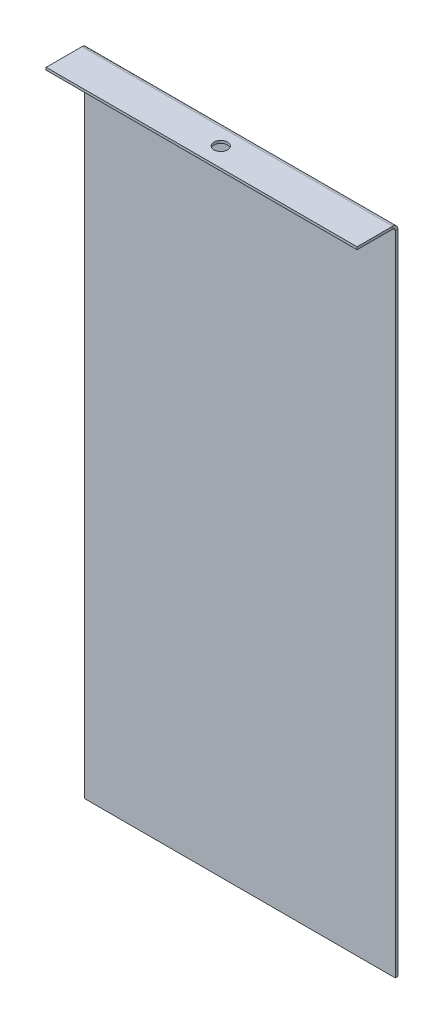
ISO-10303-21;
HEADER;
FILE_DESCRIPTION(('STEP AP214'),'2;1');
FILE_NAME('part.step','',(''),(''),'','','');
FILE_SCHEMA(('AUTOMOTIVE_DESIGN { 1 0 10303 214 1 1 1 1 }'));
ENDSEC;
DATA;
#1=APPLICATION_CONTEXT('core data for automotive mechanical design processes');
#2=APPLICATION_PROTOCOL_DEFINITION('international standard','automotive_design',2000,#1);
#3=PRODUCT_CONTEXT('',#1,'mechanical');
#4=PRODUCT('Part','Part','',(#3));
#5=PRODUCT_RELATED_PRODUCT_CATEGORY('part','',(#4));
#6=PRODUCT_DEFINITION_FORMATION('','',#4);
#7=PRODUCT_DEFINITION_CONTEXT('part definition',#1,'design');
#8=PRODUCT_DEFINITION('design','',#6,#7);
#9=PRODUCT_DEFINITION_SHAPE('','',#8);
#10=(LENGTH_UNIT() NAMED_UNIT(*) SI_UNIT(.MILLI.,.METRE.));
#11=(NAMED_UNIT(*) PLANE_ANGLE_UNIT() SI_UNIT($,.RADIAN.));
#12=(NAMED_UNIT(*) SI_UNIT($,.STERADIAN.) SOLID_ANGLE_UNIT());
#13=UNCERTAINTY_MEASURE_WITH_UNIT(LENGTH_MEASURE(1.E-05),#10,'distance_accuracy_value','');
#14=(GEOMETRIC_REPRESENTATION_CONTEXT(3) GLOBAL_UNCERTAINTY_ASSIGNED_CONTEXT((#13)) GLOBAL_UNIT_ASSIGNED_CONTEXT((#10,
#11,#12)) REPRESENTATION_CONTEXT('',''));
#15=CARTESIAN_POINT('',(0.,0.,0.));
#16=DIRECTION('',(0.,0.,1.));
#17=DIRECTION('',(1.,0.,0.));
#18=AXIS2_PLACEMENT_3D('',#15,#16,#17);
#19=CARTESIAN_POINT('',(0.,0.,1.5875));
#20=DIRECTION('',(1.,0.,0.));
#21=DIRECTION('',(0.,-1.,0.));
#22=AXIS2_PLACEMENT_3D('',#19,#20,#21);
#23=PLANE('',#22);
#24=DIRECTION('',(0.,-1.,0.));
#25=VECTOR('',#24,1.);
#26=CARTESIAN_POINT('',(0.,0.,1.5875));
#27=LINE('',#26,#25);
#28=CARTESIAN_POINT('',(0.,403.225,1.58750000000002));
#29=VERTEX_POINT('',#28);
#30=CARTESIAN_POINT('',(0.,0.,1.5875));
#31=VERTEX_POINT('',#30);
#32=EDGE_CURVE('E206',#29,#31,#27,.T.);
#33=ORIENTED_EDGE('',*,*,#32,.F.);
#34=DIRECTION('',(0.,0.,-1.));
#35=VECTOR('',#34,1.);
#36=CARTESIAN_POINT('',(0.,403.225,1.58750000000002));
#37=LINE('',#36,#35);
#38=CARTESIAN_POINT('',(0.,403.225,0.));
#39=VERTEX_POINT('',#38);
#40=EDGE_CURVE('E153',#29,#39,#37,.T.);
#41=ORIENTED_EDGE('',*,*,#40,.T.);
#42=DIRECTION('',(0.,1.,0.));
#43=VECTOR('',#42,1.);
#44=CARTESIAN_POINT('',(0.,0.,0.));
#45=LINE('',#44,#43);
#46=CARTESIAN_POINT('',(0.,0.,0.));
#47=VERTEX_POINT('',#46);
#48=EDGE_CURVE('E106',#39,#47,#45,.F.);
#49=ORIENTED_EDGE('',*,*,#48,.T.);
#50=DIRECTION('',(0.,0.,1.));
#51=VECTOR('',#50,1.);
#52=CARTESIAN_POINT('',(0.,0.,1.5875));
#53=LINE('',#52,#51);
#54=EDGE_CURVE('E77',#47,#31,#53,.T.);
#55=ORIENTED_EDGE('',*,*,#54,.T.);
#56=EDGE_LOOP('',(#33,#41,#49,#55));
#57=FACE_BOUND('',#56,.T.);
#58=ADVANCED_FACE('F67',(#57),#23,.F.);
#59=CARTESIAN_POINT('',(0.,0.,1.5875));
#60=DIRECTION('',(0.,0.,-1.));
#61=DIRECTION('',(-1.,0.,0.));
#62=AXIS2_PLACEMENT_3D('',#59,#60,#61);
#63=PLANE('',#62);
#64=DIRECTION('',(-1.,0.,0.));
#65=VECTOR('',#64,1.);
#66=CARTESIAN_POINT('',(0.,403.225,1.58750000000002));
#67=LINE('',#66,#65);
#68=CARTESIAN_POINT('',(193.675,403.225,1.58750000000002));
#69=VERTEX_POINT('',#68);
#70=EDGE_CURVE('E155',#29,#69,#67,.F.);
#71=ORIENTED_EDGE('',*,*,#70,.F.);
#72=ORIENTED_EDGE('',*,*,#32,.T.);
#73=DIRECTION('',(1.,0.,0.));
#74=VECTOR('',#73,1.);
#75=CARTESIAN_POINT('',(0.,0.,1.5875));
#76=LINE('',#75,#74);
#77=CARTESIAN_POINT('',(193.675,0.,1.5875));
#78=VERTEX_POINT('',#77);
#79=EDGE_CURVE('E209',#31,#78,#76,.T.);
#80=ORIENTED_EDGE('',*,*,#79,.T.);
#81=DIRECTION('',(0.,1.,0.));
#82=VECTOR('',#81,1.);
#83=CARTESIAN_POINT('',(193.675,0.,1.5875));
#84=LINE('',#83,#82);
#85=EDGE_CURVE('E213',#78,#69,#84,.T.);
#86=ORIENTED_EDGE('',*,*,#85,.T.);
#87=EDGE_LOOP('',(#71,#72,#80,#86));
#88=FACE_BOUND('',#87,.T.);
#89=ADVANCED_FACE('F229',(#88),#63,.F.);
#90=CARTESIAN_POINT('',(0.,0.,0.));
#91=DIRECTION('',(0.,0.,-1.));
#92=DIRECTION('',(-1.,0.,0.));
#93=AXIS2_PLACEMENT_3D('',#90,#91,#92);
#94=PLANE('',#93);
#95=ORIENTED_EDGE('',*,*,#48,.F.);
#96=DIRECTION('',(-1.,0.,0.));
#97=VECTOR('',#96,1.);
#98=CARTESIAN_POINT('',(0.,403.225,0.));
#99=LINE('',#98,#97);
#100=CARTESIAN_POINT('',(193.675,403.225,0.));
#101=VERTEX_POINT('',#100);
#102=EDGE_CURVE('E112',#39,#101,#99,.F.);
#103=ORIENTED_EDGE('',*,*,#102,.T.);
#104=DIRECTION('',(0.,1.,0.));
#105=VECTOR('',#104,1.);
#106=CARTESIAN_POINT('',(193.675,0.,0.));
#107=LINE('',#106,#105);
#108=CARTESIAN_POINT('',(193.675,0.,0.));
#109=VERTEX_POINT('',#108);
#110=EDGE_CURVE('E210',#109,#101,#107,.T.);
#111=ORIENTED_EDGE('',*,*,#110,.F.);
#112=DIRECTION('',(-1.,0.,0.));
#113=VECTOR('',#112,1.);
#114=CARTESIAN_POINT('',(0.,0.,0.));
#115=LINE('',#114,#113);
#116=EDGE_CURVE('E219',#47,#109,#115,.F.);
#117=ORIENTED_EDGE('',*,*,#116,.F.);
#118=EDGE_LOOP('',(#95,#103,#111,#117));
#119=FACE_BOUND('',#118,.T.);
#120=ADVANCED_FACE('F237',(#119),#94,.T.);
#121=CARTESIAN_POINT('',(193.675,0.,1.5875));
#122=DIRECTION('',(-1.,0.,0.));
#123=DIRECTION('',(0.,1.,0.));
#124=AXIS2_PLACEMENT_3D('',#121,#122,#123);
#125=PLANE('',#124);
#126=DIRECTION('',(0.,0.,-1.));
#127=VECTOR('',#126,1.);
#128=CARTESIAN_POINT('',(193.675,403.225,1.58750000000002));
#129=LINE('',#128,#127);
#130=EDGE_CURVE('E201',#69,#101,#129,.T.);
#131=ORIENTED_EDGE('',*,*,#130,.F.);
#132=ORIENTED_EDGE('',*,*,#85,.F.);
#133=DIRECTION('',(0.,0.,1.));
#134=VECTOR('',#133,1.);
#135=CARTESIAN_POINT('',(193.675,0.,1.5875));
#136=LINE('',#135,#134);
#137=EDGE_CURVE('E13',#109,#78,#136,.T.);
#138=ORIENTED_EDGE('',*,*,#137,.F.);
#139=ORIENTED_EDGE('',*,*,#110,.T.);
#140=EDGE_LOOP('',(#131,#132,#138,#139));
#141=FACE_BOUND('',#140,.T.);
#142=ADVANCED_FACE('F232',(#141),#125,.F.);
#143=CARTESIAN_POINT('',(0.,0.,1.5875));
#144=DIRECTION('',(0.,1.,0.));
#145=DIRECTION('',(1.,0.,0.));
#146=AXIS2_PLACEMENT_3D('',#143,#144,#145);
#147=PLANE('',#146);
#148=ORIENTED_EDGE('',*,*,#116,.T.);
#149=ORIENTED_EDGE('',*,*,#137,.T.);
#150=ORIENTED_EDGE('',*,*,#79,.F.);
#151=ORIENTED_EDGE('',*,*,#54,.F.);
#152=EDGE_LOOP('',(#148,#149,#150,#151));
#153=FACE_BOUND('',#152,.T.);
#154=ADVANCED_FACE('F69',(#153),#147,.F.);
#155=CARTESIAN_POINT('',(193.675,403.225,3.17500000000004));
#156=DIRECTION('',(1.,0.,0.));
#157=DIRECTION('',(0.,0.,-1.));
#158=AXIS2_PLACEMENT_3D('',#155,#156,#157);
#159=PLANE('',#158);
#160=DIRECTION('',(0.,-1.,0.));
#161=VECTOR('',#160,1.);
#162=CARTESIAN_POINT('',(193.675,406.4,3.17500000000004));
#163=LINE('',#162,#161);
#164=CARTESIAN_POINT('',(193.675,404.8125,3.17500000000004));
#165=VERTEX_POINT('',#164);
#166=CARTESIAN_POINT('',(193.675,406.4,3.17500000000003));
#167=VERTEX_POINT('',#166);
#168=EDGE_CURVE('E145',#165,#167,#163,.F.);
#169=ORIENTED_EDGE('',*,*,#168,.F.);
#170=CARTESIAN_POINT('',(193.675,403.225,3.17500000000004));
#171=DIRECTION('',(-1.,0.,0.));
#172=DIRECTION('',(0.,0.,1.));
#173=AXIS2_PLACEMENT_3D('',#170,#171,#172);
#174=CIRCLE('',#173,1.58750000000002);
#175=EDGE_CURVE('E138',#69,#165,#174,.F.);
#176=ORIENTED_EDGE('',*,*,#175,.F.);
#177=ORIENTED_EDGE('',*,*,#130,.T.);
#178=CARTESIAN_POINT('',(193.675,403.225,3.17500000000004));
#179=DIRECTION('',(-1.,0.,0.));
#180=DIRECTION('',(0.,0.,1.));
#181=AXIS2_PLACEMENT_3D('',#178,#179,#180);
#182=CIRCLE('',#181,3.17500000000002);
#183=EDGE_CURVE('E85',#101,#167,#182,.F.);
#184=ORIENTED_EDGE('',*,*,#183,.T.);
#185=EDGE_LOOP('',(#169,#176,#177,#184));
#186=FACE_BOUND('',#185,.T.);
#187=ADVANCED_FACE('F235',(#186),#159,.T.);
#188=CARTESIAN_POINT('',(0.,403.225,3.17500000000004));
#189=DIRECTION('',(1.,0.,0.));
#190=DIRECTION('',(0.,0.,-1.));
#191=AXIS2_PLACEMENT_3D('',#188,#189,#190);
#192=PLANE('',#191);
#193=CARTESIAN_POINT('',(0.,403.225,3.17500000000004));
#194=DIRECTION('',(-1.,0.,0.));
#195=DIRECTION('',(0.,0.,1.));
#196=AXIS2_PLACEMENT_3D('',#193,#194,#195);
#197=CIRCLE('',#196,1.58750000000002);
#198=CARTESIAN_POINT('',(0.,404.8125,3.17500000000004));
#199=VERTEX_POINT('',#198);
#200=EDGE_CURVE('E135',#199,#29,#197,.T.);
#201=ORIENTED_EDGE('',*,*,#200,.F.);
#202=DIRECTION('',(0.,-1.,0.));
#203=VECTOR('',#202,1.);
#204=CARTESIAN_POINT('',(0.,404.8125,3.17500000000004));
#205=LINE('',#204,#203);
#206=CARTESIAN_POINT('',(0.,406.4,3.17500000000003));
#207=VERTEX_POINT('',#206);
#208=EDGE_CURVE('E144',#199,#207,#205,.F.);
#209=ORIENTED_EDGE('',*,*,#208,.T.);
#210=CARTESIAN_POINT('',(0.,403.225,3.17500000000004));
#211=DIRECTION('',(-1.,0.,0.));
#212=DIRECTION('',(0.,0.,1.));
#213=AXIS2_PLACEMENT_3D('',#210,#211,#212);
#214=CIRCLE('',#213,3.17500000000002);
#215=EDGE_CURVE('E192',#207,#39,#214,.T.);
#216=ORIENTED_EDGE('',*,*,#215,.T.);
#217=ORIENTED_EDGE('',*,*,#40,.F.);
#218=EDGE_LOOP('',(#201,#209,#216,#217));
#219=FACE_BOUND('',#218,.T.);
#220=ADVANCED_FACE('F150',(#219),#192,.F.);
#221=CARTESIAN_POINT('',(0.,403.225,3.17500000000004));
#222=DIRECTION('',(-1.,0.,0.));
#223=DIRECTION('',(0.,1.,0.));
#224=AXIS2_PLACEMENT_3D('',#221,#222,#223);
#225=CYLINDRICAL_SURFACE('',#224,3.17500000000002);
#226=ORIENTED_EDGE('',*,*,#102,.F.);
#227=ORIENTED_EDGE('',*,*,#215,.F.);
#228=DIRECTION('',(-1.,0.,0.));
#229=VECTOR('',#228,1.);
#230=CARTESIAN_POINT('',(193.675,406.4,3.17500000000003));
#231=LINE('',#230,#229);
#232=EDGE_CURVE('E169',#207,#167,#231,.F.);
#233=ORIENTED_EDGE('',*,*,#232,.T.);
#234=ORIENTED_EDGE('',*,*,#183,.F.);
#235=EDGE_LOOP('',(#226,#227,#233,#234));
#236=FACE_BOUND('',#235,.T.);
#237=ADVANCED_FACE('F283',(#236),#225,.T.);
#238=CARTESIAN_POINT('',(0.,403.225,3.17500000000004));
#239=DIRECTION('',(-1.,0.,0.));
#240=DIRECTION('',(0.,1.,0.));
#241=AXIS2_PLACEMENT_3D('',#238,#239,#240);
#242=CYLINDRICAL_SURFACE('',#241,1.58750000000002);
#243=ORIENTED_EDGE('',*,*,#70,.T.);
#244=ORIENTED_EDGE('',*,*,#175,.T.);
#245=DIRECTION('',(-1.,0.,0.));
#246=VECTOR('',#245,1.);
#247=CARTESIAN_POINT('',(193.675,404.8125,3.17500000000004));
#248=LINE('',#247,#246);
#249=EDGE_CURVE('E132',#165,#199,#248,.T.);
#250=ORIENTED_EDGE('',*,*,#249,.T.);
#251=ORIENTED_EDGE('',*,*,#200,.T.);
#252=EDGE_LOOP('',(#243,#244,#250,#251));
#253=FACE_BOUND('',#252,.T.);
#254=ADVANCED_FACE('F134',(#253),#242,.F.);
#255=CARTESIAN_POINT('',(193.675,406.4,1.58749999999999));
#256=DIRECTION('',(-1.,0.,0.));
#257=DIRECTION('',(0.,0.,1.));
#258=AXIS2_PLACEMENT_3D('',#255,#256,#257);
#259=PLANE('',#258);
#260=ORIENTED_EDGE('',*,*,#168,.T.);
#261=DIRECTION('',(0.,0.,-1.));
#262=VECTOR('',#261,1.);
#263=CARTESIAN_POINT('',(193.675,406.4,-9.52933040972214E-13));
#264=LINE('',#263,#262);
#265=CARTESIAN_POINT('',(193.675,406.4,25.4));
#266=VERTEX_POINT('',#265);
#267=EDGE_CURVE('E180',#266,#167,#264,.T.);
#268=ORIENTED_EDGE('',*,*,#267,.F.);
#269=DIRECTION('',(0.,-1.,0.));
#270=VECTOR('',#269,1.);
#271=CARTESIAN_POINT('',(193.675,406.4,25.4));
#272=LINE('',#271,#270);
#273=CARTESIAN_POINT('',(193.675,404.8125,25.4));
#274=VERTEX_POINT('',#273);
#275=EDGE_CURVE('E417',#266,#274,#272,.T.);
#276=ORIENTED_EDGE('',*,*,#275,.T.);
#277=DIRECTION('',(0.,0.,1.));
#278=VECTOR('',#277,1.);
#279=CARTESIAN_POINT('',(193.675,404.8125,1.5875));
#280=LINE('',#279,#278);
#281=EDGE_CURVE('E176',#274,#165,#280,.F.);
#282=ORIENTED_EDGE('',*,*,#281,.T.);
#283=EDGE_LOOP('',(#260,#268,#276,#282));
#284=FACE_BOUND('',#283,.T.);
#285=ADVANCED_FACE('F302',(#284),#259,.F.);
#286=CARTESIAN_POINT('',(0.,406.4,25.4));
#287=DIRECTION('',(1.,0.,0.));
#288=DIRECTION('',(0.,0.,-1.));
#289=AXIS2_PLACEMENT_3D('',#286,#287,#288);
#290=PLANE('',#289);
#291=ORIENTED_EDGE('',*,*,#208,.F.);
#292=DIRECTION('',(0.,0.,-1.));
#293=VECTOR('',#292,1.);
#294=CARTESIAN_POINT('',(0.,404.8125,25.4));
#295=LINE('',#294,#293);
#296=CARTESIAN_POINT('',(0.,404.8125,25.4));
#297=VERTEX_POINT('',#296);
#298=EDGE_CURVE('E164',#199,#297,#295,.F.);
#299=ORIENTED_EDGE('',*,*,#298,.T.);
#300=DIRECTION('',(0.,-1.,0.));
#301=VECTOR('',#300,1.);
#302=CARTESIAN_POINT('',(0.,406.4,25.4));
#303=LINE('',#302,#301);
#304=CARTESIAN_POINT('',(0.,406.4,25.4));
#305=VERTEX_POINT('',#304);
#306=EDGE_CURVE('E156',#305,#297,#303,.T.);
#307=ORIENTED_EDGE('',*,*,#306,.F.);
#308=DIRECTION('',(0.,0.,1.));
#309=VECTOR('',#308,1.);
#310=CARTESIAN_POINT('',(0.,406.4,-9.52933040972214E-13));
#311=LINE('',#310,#309);
#312=EDGE_CURVE('E167',#207,#305,#311,.T.);
#313=ORIENTED_EDGE('',*,*,#312,.F.);
#314=EDGE_LOOP('',(#291,#299,#307,#313));
#315=FACE_BOUND('',#314,.T.);
#316=ADVANCED_FACE('F161',(#315),#290,.F.);
#317=CARTESIAN_POINT('',(0.,406.4,-9.52933040972214E-13));
#318=DIRECTION('',(0.,-1.,0.));
#319=DIRECTION('',(0.,0.,-1.));
#320=AXIS2_PLACEMENT_3D('',#317,#318,#319);
#321=PLANE('',#320);
#322=CARTESIAN_POINT('',(96.8375,406.4,13.462));
#323=DIRECTION('',(0.,1.,0.));
#324=DIRECTION('',(0.,0.,1.));
#325=AXIS2_PLACEMENT_3D('',#322,#323,#324);
#326=CIRCLE('',#325,4.24180000000001);
#327=CARTESIAN_POINT('',(96.8375,406.4,17.7038));
#328=VERTEX_POINT('',#327);
#329=EDGE_CURVE('E410',#328,#328,#326,.T.);
#330=ORIENTED_EDGE('',*,*,#329,.F.);
#331=EDGE_LOOP('',(#330));
#332=FACE_BOUND('',#331,.T.);
#333=ORIENTED_EDGE('',*,*,#232,.F.);
#334=ORIENTED_EDGE('',*,*,#312,.T.);
#335=DIRECTION('',(1.,0.,0.));
#336=VECTOR('',#335,1.);
#337=CARTESIAN_POINT('',(0.,406.4,25.4));
#338=LINE('',#337,#336);
#339=EDGE_CURVE('E421',#305,#266,#338,.T.);
#340=ORIENTED_EDGE('',*,*,#339,.T.);
#341=ORIENTED_EDGE('',*,*,#267,.T.);
#342=EDGE_LOOP('',(#333,#334,#340,#341));
#343=FACE_BOUND('',#342,.T.);
#344=ADVANCED_FACE('F322',(#332,#343),#321,.F.);
#345=CARTESIAN_POINT('',(0.,404.8125,-9.473903143468E-13));
#346=DIRECTION('',(0.,-1.,0.));
#347=DIRECTION('',(0.,0.,-1.));
#348=AXIS2_PLACEMENT_3D('',#345,#346,#347);
#349=PLANE('',#348);
#350=CARTESIAN_POINT('',(96.8375,404.8125,13.462));
#351=DIRECTION('',(0.,-1.,0.));
#352=DIRECTION('',(0.,0.,-1.));
#353=AXIS2_PLACEMENT_3D('',#350,#351,#352);
#354=CIRCLE('',#353,4.24180000000001);
#355=CARTESIAN_POINT('',(96.8375,404.8125,9.22019999999999));
#356=VERTEX_POINT('',#355);
#357=EDGE_CURVE('E71',#356,#356,#354,.T.);
#358=ORIENTED_EDGE('',*,*,#357,.F.);
#359=EDGE_LOOP('',(#358));
#360=FACE_BOUND('',#359,.T.);
#361=ORIENTED_EDGE('',*,*,#298,.F.);
#362=ORIENTED_EDGE('',*,*,#249,.F.);
#363=ORIENTED_EDGE('',*,*,#281,.F.);
#364=DIRECTION('',(-1.,0.,0.));
#365=VECTOR('',#364,1.);
#366=CARTESIAN_POINT('',(193.675,404.8125,25.4));
#367=LINE('',#366,#365);
#368=EDGE_CURVE('E174',#297,#274,#367,.F.);
#369=ORIENTED_EDGE('',*,*,#368,.F.);
#370=EDGE_LOOP('',(#361,#362,#363,#369));
#371=FACE_BOUND('',#370,.T.);
#372=ADVANCED_FACE('F172',(#360,#371),#349,.T.);
#373=CARTESIAN_POINT('',(193.675,406.4,25.4));
#374=DIRECTION('',(0.,0.,-1.));
#375=DIRECTION('',(0.,1.,0.));
#376=AXIS2_PLACEMENT_3D('',#373,#374,#375);
#377=PLANE('',#376);
#378=ORIENTED_EDGE('',*,*,#368,.T.);
#379=ORIENTED_EDGE('',*,*,#275,.F.);
#380=ORIENTED_EDGE('',*,*,#339,.F.);
#381=ORIENTED_EDGE('',*,*,#306,.T.);
#382=EDGE_LOOP('',(#378,#379,#380,#381));
#383=FACE_BOUND('',#382,.T.);
#384=ADVANCED_FACE('F342',(#383),#377,.F.);
#385=CARTESIAN_POINT('',(96.8375,403.86,13.462));
#386=DIRECTION('',(0.,1.,0.));
#387=DIRECTION('',(0.,0.,1.));
#388=AXIS2_PLACEMENT_3D('',#385,#386,#387);
#389=CYLINDRICAL_SURFACE('',#388,4.24180000000001);
#390=ORIENTED_EDGE('',*,*,#357,.T.);
#391=EDGE_LOOP('',(#390));
#392=FACE_BOUND('',#391,.T.);
#393=ORIENTED_EDGE('',*,*,#329,.T.);
#394=EDGE_LOOP('',(#393));
#395=FACE_BOUND('',#394,.T.);
#396=ADVANCED_FACE('F353',(#392,#395),#389,.F.);
#397=CLOSED_SHELL('',(#58,#89,#120,#142,#154,#187,#220,#237,#254,#285,#316,#344,#372,#384,#396));
#398=MANIFOLD_SOLID_BREP('B2',#397);
#399=ADVANCED_BREP_SHAPE_REPRESENTATION('',(#18,#398),#14);
#400=SHAPE_DEFINITION_REPRESENTATION(#9,#399);
ENDSEC;
END-ISO-10303-21;
